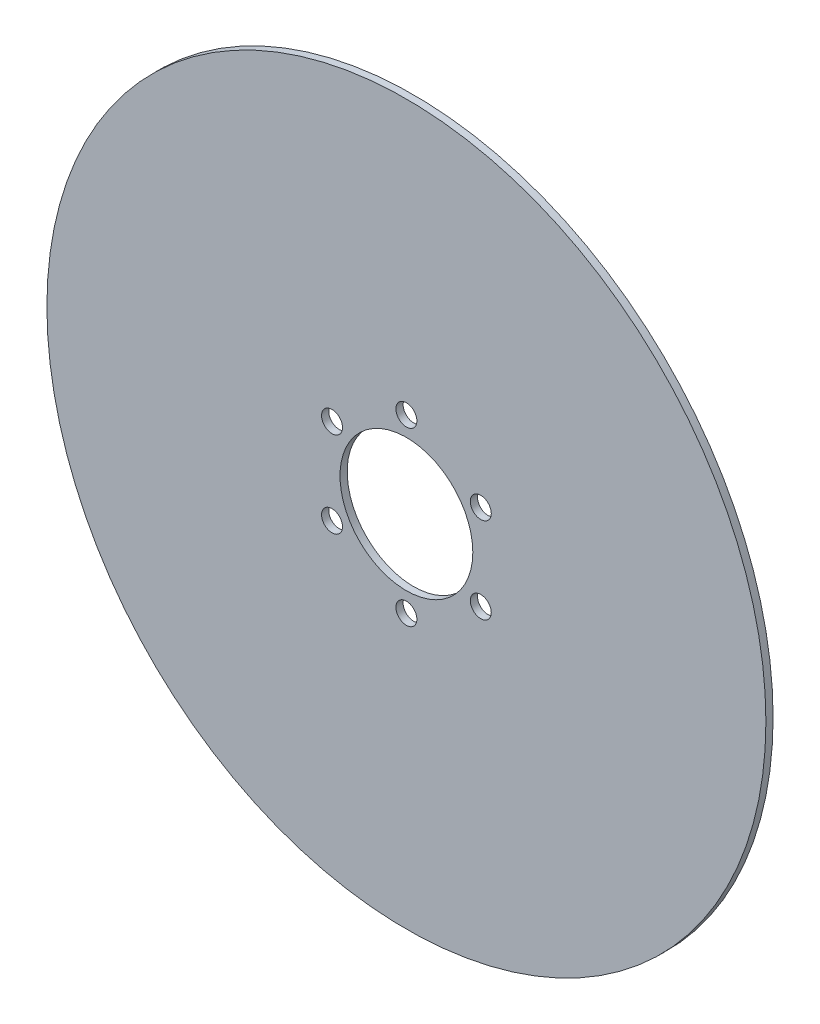
ISO-10303-21;
HEADER;
FILE_DESCRIPTION(('STEP AP214'),'2;1');
FILE_NAME('part.step','',(''),(''),'','','');
FILE_SCHEMA(('AUTOMOTIVE_DESIGN { 1 0 10303 214 1 1 1 1 }'));
ENDSEC;
DATA;
#1=APPLICATION_CONTEXT('core data for automotive mechanical design processes');
#2=APPLICATION_PROTOCOL_DEFINITION('international standard','automotive_design',2000,#1);
#3=PRODUCT_CONTEXT('',#1,'mechanical');
#4=PRODUCT('Part','Part','',(#3));
#5=PRODUCT_RELATED_PRODUCT_CATEGORY('part','',(#4));
#6=PRODUCT_DEFINITION_FORMATION('','',#4);
#7=PRODUCT_DEFINITION_CONTEXT('part definition',#1,'design');
#8=PRODUCT_DEFINITION('design','',#6,#7);
#9=PRODUCT_DEFINITION_SHAPE('','',#8);
#10=(LENGTH_UNIT() NAMED_UNIT(*) SI_UNIT(.MILLI.,.METRE.));
#11=(NAMED_UNIT(*) PLANE_ANGLE_UNIT() SI_UNIT($,.RADIAN.));
#12=(NAMED_UNIT(*) SI_UNIT($,.STERADIAN.) SOLID_ANGLE_UNIT());
#13=UNCERTAINTY_MEASURE_WITH_UNIT(LENGTH_MEASURE(1.E-05),#10,'distance_accuracy_value','');
#14=(GEOMETRIC_REPRESENTATION_CONTEXT(3) GLOBAL_UNCERTAINTY_ASSIGNED_CONTEXT((#13)) GLOBAL_UNIT_ASSIGNED_CONTEXT((#10,
#11,#12)) REPRESENTATION_CONTEXT('',''));
#15=CARTESIAN_POINT('',(0.,0.,0.));
#16=DIRECTION('',(0.,0.,1.));
#17=DIRECTION('',(1.,0.,0.));
#18=AXIS2_PLACEMENT_3D('',#15,#16,#17);
#19=CARTESIAN_POINT('',(0.,0.,-0.9));
#20=DIRECTION('',(0.,0.,1.));
#21=DIRECTION('',(1.,0.,0.));
#22=AXIS2_PLACEMENT_3D('',#19,#20,#21);
#23=CYLINDRICAL_SURFACE('',#22,90.);
#24=CARTESIAN_POINT('',(0.,0.,-0.9));
#25=DIRECTION('',(0.,0.,1.));
#26=DIRECTION('',(1.,0.,0.));
#27=AXIS2_PLACEMENT_3D('',#24,#25,#26);
#28=CIRCLE('',#27,90.);
#29=CARTESIAN_POINT('',(90.,0.,-0.9));
#30=VERTEX_POINT('',#29);
#31=EDGE_CURVE('E10',#30,#30,#28,.T.);
#32=ORIENTED_EDGE('',*,*,#31,.T.);
#33=EDGE_LOOP('',(#32));
#34=FACE_BOUND('',#33,.T.);
#35=CARTESIAN_POINT('',(0.,0.,0.9));
#36=DIRECTION('',(0.,0.,1.));
#37=DIRECTION('',(1.,0.,0.));
#38=AXIS2_PLACEMENT_3D('',#35,#36,#37);
#39=CIRCLE('',#38,90.);
#40=CARTESIAN_POINT('',(90.,0.,0.9));
#41=VERTEX_POINT('',#40);
#42=EDGE_CURVE('E62',#41,#41,#39,.T.);
#43=ORIENTED_EDGE('',*,*,#42,.F.);
#44=EDGE_LOOP('',(#43));
#45=FACE_BOUND('',#44,.T.);
#46=ADVANCED_FACE('F31',(#34,#45),#23,.T.);
#47=CARTESIAN_POINT('',(0.,0.,-0.9));
#48=DIRECTION('',(0.,0.,1.));
#49=DIRECTION('',(1.,0.,0.));
#50=AXIS2_PLACEMENT_3D('',#47,#48,#49);
#51=PLANE('',#50);
#52=CARTESIAN_POINT('',(-18.6195461813654,10.75,-0.9));
#53=DIRECTION('',(0.,0.,1.));
#54=DIRECTION('',(1.,0.,0.));
#55=AXIS2_PLACEMENT_3D('',#52,#53,#54);
#56=CIRCLE('',#55,2.625);
#57=CARTESIAN_POINT('',(-15.9945461813654,10.75,-0.9));
#58=VERTEX_POINT('',#57);
#59=EDGE_CURVE('E59',#58,#58,#56,.T.);
#60=ORIENTED_EDGE('',*,*,#59,.T.);
#61=EDGE_LOOP('',(#60));
#62=FACE_BOUND('',#61,.T.);
#63=CARTESIAN_POINT('',(-18.6195461813654,-10.75,-0.9));
#64=DIRECTION('',(0.,0.,1.));
#65=DIRECTION('',(1.,0.,0.));
#66=AXIS2_PLACEMENT_3D('',#63,#64,#65);
#67=CIRCLE('',#66,2.625);
#68=CARTESIAN_POINT('',(-15.9945461813654,-10.75,-0.9));
#69=VERTEX_POINT('',#68);
#70=EDGE_CURVE('E56',#69,#69,#67,.T.);
#71=ORIENTED_EDGE('',*,*,#70,.T.);
#72=EDGE_LOOP('',(#71));
#73=FACE_BOUND('',#72,.T.);
#74=CARTESIAN_POINT('',(0.,-21.5,-0.9));
#75=DIRECTION('',(0.,0.,1.));
#76=DIRECTION('',(1.,0.,0.));
#77=AXIS2_PLACEMENT_3D('',#74,#75,#76);
#78=CIRCLE('',#77,2.625);
#79=CARTESIAN_POINT('',(2.625,-21.5,-0.9));
#80=VERTEX_POINT('',#79);
#81=EDGE_CURVE('E53',#80,#80,#78,.T.);
#82=ORIENTED_EDGE('',*,*,#81,.T.);
#83=EDGE_LOOP('',(#82));
#84=FACE_BOUND('',#83,.T.);
#85=CARTESIAN_POINT('',(18.6195461813654,-10.75,-0.9));
#86=DIRECTION('',(0.,0.,1.));
#87=DIRECTION('',(1.,0.,0.));
#88=AXIS2_PLACEMENT_3D('',#85,#86,#87);
#89=CIRCLE('',#88,2.625);
#90=CARTESIAN_POINT('',(21.2445461813654,-10.75,-0.9));
#91=VERTEX_POINT('',#90);
#92=EDGE_CURVE('E50',#91,#91,#89,.T.);
#93=ORIENTED_EDGE('',*,*,#92,.T.);
#94=EDGE_LOOP('',(#93));
#95=FACE_BOUND('',#94,.T.);
#96=CARTESIAN_POINT('',(18.6195461813654,10.75,-0.9));
#97=DIRECTION('',(0.,0.,1.));
#98=DIRECTION('',(1.,0.,0.));
#99=AXIS2_PLACEMENT_3D('',#96,#97,#98);
#100=CIRCLE('',#99,2.625);
#101=CARTESIAN_POINT('',(21.2445461813654,10.75,-0.9));
#102=VERTEX_POINT('',#101);
#103=EDGE_CURVE('E45',#102,#102,#100,.T.);
#104=ORIENTED_EDGE('',*,*,#103,.T.);
#105=EDGE_LOOP('',(#104));
#106=FACE_BOUND('',#105,.T.);
#107=CARTESIAN_POINT('',(0.,21.5,-0.9));
#108=DIRECTION('',(0.,0.,1.));
#109=DIRECTION('',(1.,0.,0.));
#110=AXIS2_PLACEMENT_3D('',#107,#108,#109);
#111=CIRCLE('',#110,2.625);
#112=CARTESIAN_POINT('',(2.625,21.5,-0.9));
#113=VERTEX_POINT('',#112);
#114=EDGE_CURVE('E41',#113,#113,#111,.T.);
#115=ORIENTED_EDGE('',*,*,#114,.T.);
#116=EDGE_LOOP('',(#115));
#117=FACE_BOUND('',#116,.T.);
#118=CARTESIAN_POINT('',(0.,0.,-0.9));
#119=DIRECTION('',(0.,0.,1.));
#120=DIRECTION('',(1.,0.,0.));
#121=AXIS2_PLACEMENT_3D('',#118,#119,#120);
#122=CIRCLE('',#121,16.625);
#123=CARTESIAN_POINT('',(16.625,0.,-0.9));
#124=VERTEX_POINT('',#123);
#125=EDGE_CURVE('E37',#124,#124,#122,.T.);
#126=ORIENTED_EDGE('',*,*,#125,.T.);
#127=EDGE_LOOP('',(#126));
#128=FACE_BOUND('',#127,.T.);
#129=ORIENTED_EDGE('',*,*,#31,.F.);
#130=EDGE_LOOP('',(#129));
#131=FACE_BOUND('',#130,.T.);
#132=ADVANCED_FACE('F102',(#62,#73,#84,#95,#106,#117,#128,#131),#51,.F.);
#133=CARTESIAN_POINT('',(0.,0.,-0.9));
#134=DIRECTION('',(0.,0.,1.));
#135=DIRECTION('',(1.,0.,0.));
#136=AXIS2_PLACEMENT_3D('',#133,#134,#135);
#137=CYLINDRICAL_SURFACE('',#136,16.625);
#138=ORIENTED_EDGE('',*,*,#125,.F.);
#139=EDGE_LOOP('',(#138));
#140=FACE_BOUND('',#139,.T.);
#141=CARTESIAN_POINT('',(0.,0.,0.9));
#142=DIRECTION('',(0.,0.,1.));
#143=DIRECTION('',(1.,0.,0.));
#144=AXIS2_PLACEMENT_3D('',#141,#142,#143);
#145=CIRCLE('',#144,16.625);
#146=CARTESIAN_POINT('',(16.625,0.,0.9));
#147=VERTEX_POINT('',#146);
#148=EDGE_CURVE('E65',#147,#147,#145,.T.);
#149=ORIENTED_EDGE('',*,*,#148,.T.);
#150=EDGE_LOOP('',(#149));
#151=FACE_BOUND('',#150,.T.);
#152=ADVANCED_FACE('F106',(#140,#151),#137,.F.);
#153=CARTESIAN_POINT('',(0.,21.5,-0.9));
#154=DIRECTION('',(0.,0.,1.));
#155=DIRECTION('',(1.,0.,0.));
#156=AXIS2_PLACEMENT_3D('',#153,#154,#155);
#157=CYLINDRICAL_SURFACE('',#156,2.625);
#158=ORIENTED_EDGE('',*,*,#114,.F.);
#159=EDGE_LOOP('',(#158));
#160=FACE_BOUND('',#159,.T.);
#161=CARTESIAN_POINT('',(0.,21.5,0.9));
#162=DIRECTION('',(0.,0.,1.));
#163=DIRECTION('',(1.,0.,0.));
#164=AXIS2_PLACEMENT_3D('',#161,#162,#163);
#165=CIRCLE('',#164,2.625);
#166=CARTESIAN_POINT('',(2.625,21.5,0.9));
#167=VERTEX_POINT('',#166);
#168=EDGE_CURVE('E68',#167,#167,#165,.T.);
#169=ORIENTED_EDGE('',*,*,#168,.T.);
#170=EDGE_LOOP('',(#169));
#171=FACE_BOUND('',#170,.T.);
#172=ADVANCED_FACE('F136',(#160,#171),#157,.F.);
#173=CARTESIAN_POINT('',(18.6195461813654,10.75,-0.9));
#174=DIRECTION('',(0.,0.,1.));
#175=DIRECTION('',(1.,0.,0.));
#176=AXIS2_PLACEMENT_3D('',#173,#174,#175);
#177=CYLINDRICAL_SURFACE('',#176,2.625);
#178=ORIENTED_EDGE('',*,*,#103,.F.);
#179=EDGE_LOOP('',(#178));
#180=FACE_BOUND('',#179,.T.);
#181=CARTESIAN_POINT('',(18.6195461813654,10.75,0.9));
#182=DIRECTION('',(0.,0.,1.));
#183=DIRECTION('',(1.,0.,0.));
#184=AXIS2_PLACEMENT_3D('',#181,#182,#183);
#185=CIRCLE('',#184,2.625);
#186=CARTESIAN_POINT('',(21.2445461813654,10.75,0.9));
#187=VERTEX_POINT('',#186);
#188=EDGE_CURVE('E71',#187,#187,#185,.T.);
#189=ORIENTED_EDGE('',*,*,#188,.T.);
#190=EDGE_LOOP('',(#189));
#191=FACE_BOUND('',#190,.T.);
#192=ADVANCED_FACE('F129',(#180,#191),#177,.F.);
#193=CARTESIAN_POINT('',(18.6195461813654,-10.75,-0.9));
#194=DIRECTION('',(0.,0.,1.));
#195=DIRECTION('',(1.,0.,0.));
#196=AXIS2_PLACEMENT_3D('',#193,#194,#195);
#197=CYLINDRICAL_SURFACE('',#196,2.625);
#198=ORIENTED_EDGE('',*,*,#92,.F.);
#199=EDGE_LOOP('',(#198));
#200=FACE_BOUND('',#199,.T.);
#201=CARTESIAN_POINT('',(18.6195461813654,-10.75,0.9));
#202=DIRECTION('',(0.,0.,1.));
#203=DIRECTION('',(1.,0.,0.));
#204=AXIS2_PLACEMENT_3D('',#201,#202,#203);
#205=CIRCLE('',#204,2.625);
#206=CARTESIAN_POINT('',(21.2445461813654,-10.75,0.9));
#207=VERTEX_POINT('',#206);
#208=EDGE_CURVE('E74',#207,#207,#205,.T.);
#209=ORIENTED_EDGE('',*,*,#208,.T.);
#210=EDGE_LOOP('',(#209));
#211=FACE_BOUND('',#210,.T.);
#212=ADVANCED_FACE('F120',(#200,#211),#197,.F.);
#213=CARTESIAN_POINT('',(0.,-21.5,-0.9));
#214=DIRECTION('',(0.,0.,1.));
#215=DIRECTION('',(1.,0.,0.));
#216=AXIS2_PLACEMENT_3D('',#213,#214,#215);
#217=CYLINDRICAL_SURFACE('',#216,2.625);
#218=ORIENTED_EDGE('',*,*,#81,.F.);
#219=EDGE_LOOP('',(#218));
#220=FACE_BOUND('',#219,.T.);
#221=CARTESIAN_POINT('',(0.,-21.5,0.9));
#222=DIRECTION('',(0.,0.,1.));
#223=DIRECTION('',(1.,0.,0.));
#224=AXIS2_PLACEMENT_3D('',#221,#222,#223);
#225=CIRCLE('',#224,2.625);
#226=CARTESIAN_POINT('',(2.625,-21.5,0.9));
#227=VERTEX_POINT('',#226);
#228=EDGE_CURVE('E77',#227,#227,#225,.T.);
#229=ORIENTED_EDGE('',*,*,#228,.T.);
#230=EDGE_LOOP('',(#229));
#231=FACE_BOUND('',#230,.T.);
#232=ADVANCED_FACE('F118',(#220,#231),#217,.F.);
#233=CARTESIAN_POINT('',(-18.6195461813654,-10.75,-0.9));
#234=DIRECTION('',(0.,0.,1.));
#235=DIRECTION('',(1.,0.,0.));
#236=AXIS2_PLACEMENT_3D('',#233,#234,#235);
#237=CYLINDRICAL_SURFACE('',#236,2.625);
#238=ORIENTED_EDGE('',*,*,#70,.F.);
#239=EDGE_LOOP('',(#238));
#240=FACE_BOUND('',#239,.T.);
#241=CARTESIAN_POINT('',(-18.6195461813654,-10.75,0.9));
#242=DIRECTION('',(0.,0.,1.));
#243=DIRECTION('',(1.,0.,0.));
#244=AXIS2_PLACEMENT_3D('',#241,#242,#243);
#245=CIRCLE('',#244,2.625);
#246=CARTESIAN_POINT('',(-15.9945461813654,-10.75,0.9));
#247=VERTEX_POINT('',#246);
#248=EDGE_CURVE('E80',#247,#247,#245,.T.);
#249=ORIENTED_EDGE('',*,*,#248,.T.);
#250=EDGE_LOOP('',(#249));
#251=FACE_BOUND('',#250,.T.);
#252=ADVANCED_FACE('F96',(#240,#251),#237,.F.);
#253=CARTESIAN_POINT('',(-18.6195461813654,10.75,-0.9));
#254=DIRECTION('',(0.,0.,1.));
#255=DIRECTION('',(1.,0.,0.));
#256=AXIS2_PLACEMENT_3D('',#253,#254,#255);
#257=CYLINDRICAL_SURFACE('',#256,2.625);
#258=ORIENTED_EDGE('',*,*,#59,.F.);
#259=EDGE_LOOP('',(#258));
#260=FACE_BOUND('',#259,.T.);
#261=CARTESIAN_POINT('',(-18.6195461813654,10.75,0.9));
#262=DIRECTION('',(0.,0.,1.));
#263=DIRECTION('',(1.,0.,0.));
#264=AXIS2_PLACEMENT_3D('',#261,#262,#263);
#265=CIRCLE('',#264,2.625);
#266=CARTESIAN_POINT('',(-15.9945461813654,10.75,0.9));
#267=VERTEX_POINT('',#266);
#268=EDGE_CURVE('E83',#267,#267,#265,.T.);
#269=ORIENTED_EDGE('',*,*,#268,.T.);
#270=EDGE_LOOP('',(#269));
#271=FACE_BOUND('',#270,.T.);
#272=ADVANCED_FACE('F87',(#260,#271),#257,.F.);
#273=CARTESIAN_POINT('',(0.,0.,0.9));
#274=DIRECTION('',(0.,0.,1.));
#275=DIRECTION('',(1.,0.,0.));
#276=AXIS2_PLACEMENT_3D('',#273,#274,#275);
#277=PLANE('',#276);
#278=ORIENTED_EDGE('',*,*,#248,.F.);
#279=EDGE_LOOP('',(#278));
#280=FACE_BOUND('',#279,.T.);
#281=ORIENTED_EDGE('',*,*,#208,.F.);
#282=EDGE_LOOP('',(#281));
#283=FACE_BOUND('',#282,.T.);
#284=ORIENTED_EDGE('',*,*,#168,.F.);
#285=EDGE_LOOP('',(#284));
#286=FACE_BOUND('',#285,.T.);
#287=ORIENTED_EDGE('',*,*,#42,.T.);
#288=EDGE_LOOP('',(#287));
#289=FACE_BOUND('',#288,.T.);
#290=ORIENTED_EDGE('',*,*,#148,.F.);
#291=EDGE_LOOP('',(#290));
#292=FACE_BOUND('',#291,.T.);
#293=ORIENTED_EDGE('',*,*,#188,.F.);
#294=EDGE_LOOP('',(#293));
#295=FACE_BOUND('',#294,.T.);
#296=ORIENTED_EDGE('',*,*,#228,.F.);
#297=EDGE_LOOP('',(#296));
#298=FACE_BOUND('',#297,.T.);
#299=ORIENTED_EDGE('',*,*,#268,.F.);
#300=EDGE_LOOP('',(#299));
#301=FACE_BOUND('',#300,.T.);
#302=ADVANCED_FACE('F89',(#280,#283,#286,#289,#292,#295,#298,#301),#277,.T.);
#303=CLOSED_SHELL('',(#46,#132,#152,#172,#192,#212,#232,#252,#272,#302));
#304=MANIFOLD_SOLID_BREP('B2',#303);
#305=ADVANCED_BREP_SHAPE_REPRESENTATION('',(#18,#304),#14);
#306=SHAPE_DEFINITION_REPRESENTATION(#9,#305);
ENDSEC;
END-ISO-10303-21;
